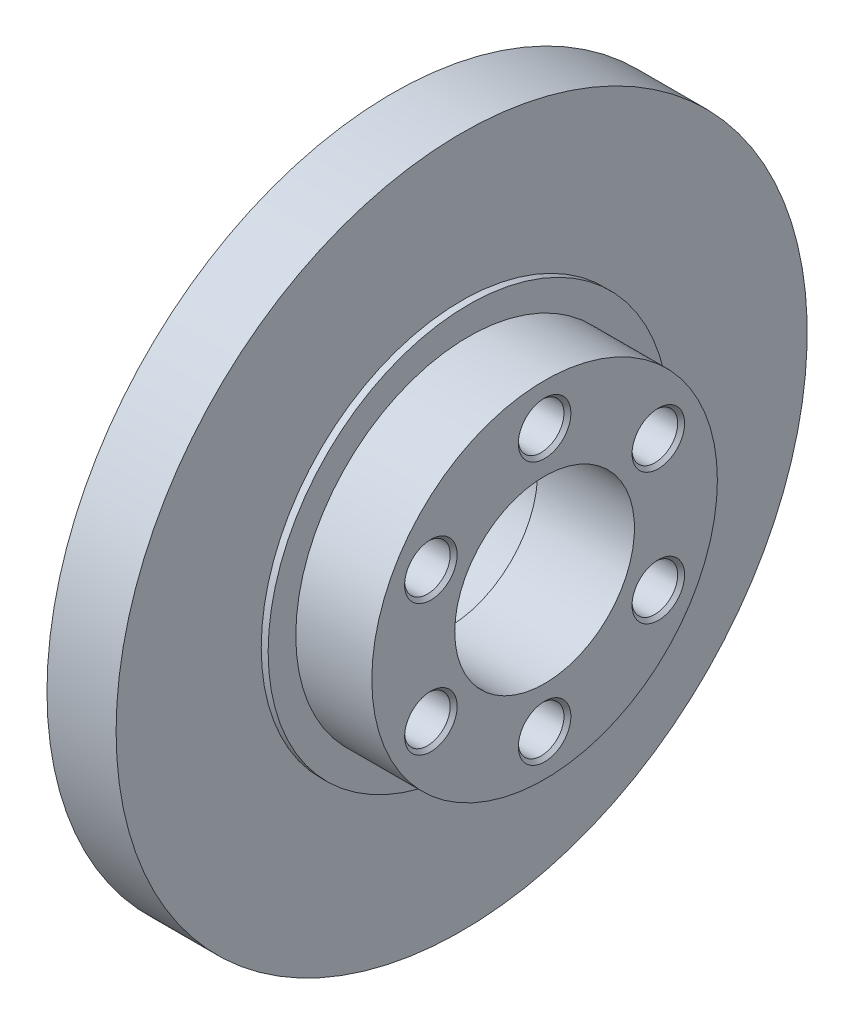
ISO-10303-21;
HEADER;
FILE_DESCRIPTION(('STEP AP214'),'2;1');
FILE_NAME('part.step','',(''),(''),'','','');
FILE_SCHEMA(('AUTOMOTIVE_DESIGN { 1 0 10303 214 1 1 1 1 }'));
ENDSEC;
DATA;
#1=APPLICATION_CONTEXT('core data for automotive mechanical design processes');
#2=APPLICATION_PROTOCOL_DEFINITION('international standard','automotive_design',2000,#1);
#3=PRODUCT_CONTEXT('',#1,'mechanical');
#4=PRODUCT('Part','Part','',(#3));
#5=PRODUCT_RELATED_PRODUCT_CATEGORY('part','',(#4));
#6=PRODUCT_DEFINITION_FORMATION('','',#4);
#7=PRODUCT_DEFINITION_CONTEXT('part definition',#1,'design');
#8=PRODUCT_DEFINITION('design','',#6,#7);
#9=PRODUCT_DEFINITION_SHAPE('','',#8);
#10=(LENGTH_UNIT() NAMED_UNIT(*) SI_UNIT(.MILLI.,.METRE.));
#11=(NAMED_UNIT(*) PLANE_ANGLE_UNIT() SI_UNIT($,.RADIAN.));
#12=(NAMED_UNIT(*) SI_UNIT($,.STERADIAN.) SOLID_ANGLE_UNIT());
#13=UNCERTAINTY_MEASURE_WITH_UNIT(LENGTH_MEASURE(1.E-05),#10,'distance_accuracy_value','');
#14=(GEOMETRIC_REPRESENTATION_CONTEXT(3) GLOBAL_UNCERTAINTY_ASSIGNED_CONTEXT((#13)) GLOBAL_UNIT_ASSIGNED_CONTEXT((#10,
#11,#12)) REPRESENTATION_CONTEXT('',''));
#15=CARTESIAN_POINT('',(0.,0.,0.));
#16=DIRECTION('',(0.,0.,1.));
#17=DIRECTION('',(1.,0.,0.));
#18=AXIS2_PLACEMENT_3D('',#15,#16,#17);
#19=CARTESIAN_POINT('',(0.,14.,0.));
#20=DIRECTION('',(1.,0.,0.));
#21=DIRECTION('',(0.,0.,-1.));
#22=AXIS2_PLACEMENT_3D('',#19,#20,#21);
#23=PLANE('',#22);
#24=CARTESIAN_POINT('',(0.,40.,0.));
#25=DIRECTION('',(1.,0.,0.));
#26=DIRECTION('',(0.,0.,-1.));
#27=AXIS2_PLACEMENT_3D('',#24,#25,#26);
#28=CIRCLE('',#27,2.5);
#29=CARTESIAN_POINT('',(0.,40.,-2.5));
#30=VERTEX_POINT('',#29);
#31=EDGE_CURVE('E200',#30,#30,#28,.T.);
#32=ORIENTED_EDGE('',*,*,#31,.T.);
#33=EDGE_LOOP('',(#32));
#34=FACE_BOUND('',#33,.T.);
#35=CARTESIAN_POINT('',(0.,28.2842712474619,-28.284271247462));
#36=DIRECTION('',(1.,0.,0.));
#37=DIRECTION('',(0.,0.,-1.));
#38=AXIS2_PLACEMENT_3D('',#35,#36,#37);
#39=CIRCLE('',#38,2.5);
#40=CARTESIAN_POINT('',(0.,28.2842712474619,-30.784271247462));
#41=VERTEX_POINT('',#40);
#42=EDGE_CURVE('E196',#41,#41,#39,.T.);
#43=ORIENTED_EDGE('',*,*,#42,.T.);
#44=EDGE_LOOP('',(#43));
#45=FACE_BOUND('',#44,.T.);
#46=CARTESIAN_POINT('',(0.,-1.39659253553725E-13,-40.));
#47=DIRECTION('',(1.,0.,0.));
#48=DIRECTION('',(0.,0.,-1.));
#49=AXIS2_PLACEMENT_3D('',#46,#47,#48);
#50=CIRCLE('',#49,2.5);
#51=CARTESIAN_POINT('',(0.,-1.39659253553725E-13,-42.5));
#52=VERTEX_POINT('',#51);
#53=EDGE_CURVE('E188',#52,#52,#50,.T.);
#54=ORIENTED_EDGE('',*,*,#53,.T.);
#55=EDGE_LOOP('',(#54));
#56=FACE_BOUND('',#55,.T.);
#57=CARTESIAN_POINT('',(0.,-28.2842712474621,-28.2842712474618));
#58=DIRECTION('',(1.,0.,0.));
#59=DIRECTION('',(0.,0.,-1.));
#60=AXIS2_PLACEMENT_3D('',#57,#58,#59);
#61=CIRCLE('',#60,2.5);
#62=CARTESIAN_POINT('',(0.,-28.2842712474621,-30.7842712474617));
#63=VERTEX_POINT('',#62);
#64=EDGE_CURVE('E180',#63,#63,#61,.T.);
#65=ORIENTED_EDGE('',*,*,#64,.T.);
#66=EDGE_LOOP('',(#65));
#67=FACE_BOUND('',#66,.T.);
#68=CARTESIAN_POINT('',(0.,-40.,2.79318507107451E-13));
#69=DIRECTION('',(1.,0.,0.));
#70=DIRECTION('',(0.,0.,-1.));
#71=AXIS2_PLACEMENT_3D('',#68,#69,#70);
#72=CIRCLE('',#71,2.5);
#73=CARTESIAN_POINT('',(0.,-40.,-2.49999999999972));
#74=VERTEX_POINT('',#73);
#75=EDGE_CURVE('E172',#74,#74,#72,.T.);
#76=ORIENTED_EDGE('',*,*,#75,.T.);
#77=EDGE_LOOP('',(#76));
#78=FACE_BOUND('',#77,.T.);
#79=CARTESIAN_POINT('',(0.,-28.2842712474617,28.2842712474621));
#80=DIRECTION('',(1.,0.,0.));
#81=DIRECTION('',(0.,0.,-1.));
#82=AXIS2_PLACEMENT_3D('',#79,#80,#81);
#83=CIRCLE('',#82,2.5);
#84=CARTESIAN_POINT('',(0.,-28.2842712474617,25.7842712474622));
#85=VERTEX_POINT('',#84);
#86=EDGE_CURVE('E164',#85,#85,#83,.T.);
#87=ORIENTED_EDGE('',*,*,#86,.T.);
#88=EDGE_LOOP('',(#87));
#89=FACE_BOUND('',#88,.T.);
#90=CARTESIAN_POINT('',(0.,4.18977760661176E-13,40.));
#91=DIRECTION('',(1.,0.,0.));
#92=DIRECTION('',(0.,0.,-1.));
#93=AXIS2_PLACEMENT_3D('',#90,#91,#92);
#94=CIRCLE('',#93,2.5);
#95=CARTESIAN_POINT('',(0.,4.18977760661176E-13,37.5));
#96=VERTEX_POINT('',#95);
#97=EDGE_CURVE('E156',#96,#96,#94,.T.);
#98=ORIENTED_EDGE('',*,*,#97,.T.);
#99=EDGE_LOOP('',(#98));
#100=FACE_BOUND('',#99,.T.);
#101=CARTESIAN_POINT('',(0.,28.2842712474622,28.2842712474616));
#102=DIRECTION('',(1.,0.,0.));
#103=DIRECTION('',(0.,0.,-1.));
#104=AXIS2_PLACEMENT_3D('',#101,#102,#103);
#105=CIRCLE('',#104,2.5);
#106=CARTESIAN_POINT('',(0.,28.2842712474622,25.7842712474616));
#107=VERTEX_POINT('',#106);
#108=EDGE_CURVE('E147',#107,#107,#105,.T.);
#109=ORIENTED_EDGE('',*,*,#108,.T.);
#110=EDGE_LOOP('',(#109));
#111=FACE_BOUND('',#110,.T.);
#112=CARTESIAN_POINT('',(0.,0.,0.));
#113=DIRECTION('',(-1.,0.,0.));
#114=DIRECTION('',(0.,0.,1.));
#115=AXIS2_PLACEMENT_3D('',#112,#113,#114);
#116=CIRCLE('',#115,14.);
#117=CARTESIAN_POINT('',(0.,0.,14.));
#118=VERTEX_POINT('',#117);
#119=EDGE_CURVE('E138',#118,#118,#116,.T.);
#120=ORIENTED_EDGE('',*,*,#119,.F.);
#121=EDGE_LOOP('',(#120));
#122=FACE_BOUND('',#121,.T.);
#123=CARTESIAN_POINT('',(0.,0.,0.));
#124=DIRECTION('',(-1.,0.,0.));
#125=DIRECTION('',(0.,0.,1.));
#126=AXIS2_PLACEMENT_3D('',#123,#124,#125);
#127=CIRCLE('',#126,50.);
#128=CARTESIAN_POINT('',(0.,0.,50.));
#129=VERTEX_POINT('',#128);
#130=EDGE_CURVE('E102',#129,#129,#127,.T.);
#131=ORIENTED_EDGE('',*,*,#130,.T.);
#132=EDGE_LOOP('',(#131));
#133=FACE_BOUND('',#132,.T.);
#134=ADVANCED_FACE('F45',(#34,#45,#56,#67,#78,#89,#100,#111,#122,#133),#23,.F.);
#135=CARTESIAN_POINT('',(0.,0.,0.));
#136=DIRECTION('',(-1.,0.,0.));
#137=DIRECTION('',(0.,0.,1.));
#138=AXIS2_PLACEMENT_3D('',#135,#136,#137);
#139=CYLINDRICAL_SURFACE('',#138,50.);
#140=ORIENTED_EDGE('',*,*,#130,.F.);
#141=EDGE_LOOP('',(#140));
#142=FACE_BOUND('',#141,.T.);
#143=CARTESIAN_POINT('',(10.,0.,0.));
#144=DIRECTION('',(-1.,0.,0.));
#145=DIRECTION('',(0.,0.,1.));
#146=AXIS2_PLACEMENT_3D('',#143,#144,#145);
#147=CIRCLE('',#146,50.);
#148=CARTESIAN_POINT('',(10.,0.,50.));
#149=VERTEX_POINT('',#148);
#150=EDGE_CURVE('E106',#149,#149,#147,.T.);
#151=ORIENTED_EDGE('',*,*,#150,.T.);
#152=EDGE_LOOP('',(#151));
#153=FACE_BOUND('',#152,.T.);
#154=ADVANCED_FACE('F250',(#142,#153),#139,.T.);
#155=CARTESIAN_POINT('',(10.,50.,0.));
#156=DIRECTION('',(-1.,0.,0.));
#157=DIRECTION('',(0.,0.,1.));
#158=AXIS2_PLACEMENT_3D('',#155,#156,#157);
#159=PLANE('',#158);
#160=ORIENTED_EDGE('',*,*,#150,.F.);
#161=EDGE_LOOP('',(#160));
#162=FACE_BOUND('',#161,.T.);
#163=CARTESIAN_POINT('',(10.,0.,0.));
#164=DIRECTION('',(-1.,0.,0.));
#165=DIRECTION('',(0.,0.,1.));
#166=AXIS2_PLACEMENT_3D('',#163,#164,#165);
#167=CIRCLE('',#166,29.);
#168=CARTESIAN_POINT('',(10.,0.,29.));
#169=VERTEX_POINT('',#168);
#170=EDGE_CURVE('E110',#169,#169,#167,.T.);
#171=ORIENTED_EDGE('',*,*,#170,.T.);
#172=EDGE_LOOP('',(#171));
#173=FACE_BOUND('',#172,.T.);
#174=ADVANCED_FACE('F258',(#162,#173),#159,.F.);
#175=CARTESIAN_POINT('',(0.,0.,0.));
#176=DIRECTION('',(-1.,0.,0.));
#177=DIRECTION('',(0.,0.,1.));
#178=AXIS2_PLACEMENT_3D('',#175,#176,#177);
#179=CYLINDRICAL_SURFACE('',#178,29.);
#180=ORIENTED_EDGE('',*,*,#170,.F.);
#181=EDGE_LOOP('',(#180));
#182=FACE_BOUND('',#181,.T.);
#183=CARTESIAN_POINT('',(11.,0.,0.));
#184=DIRECTION('',(-1.,0.,0.));
#185=DIRECTION('',(0.,0.,1.));
#186=AXIS2_PLACEMENT_3D('',#183,#184,#185);
#187=CIRCLE('',#186,29.);
#188=CARTESIAN_POINT('',(11.,0.,29.));
#189=VERTEX_POINT('',#188);
#190=EDGE_CURVE('E114',#189,#189,#187,.T.);
#191=ORIENTED_EDGE('',*,*,#190,.T.);
#192=EDGE_LOOP('',(#191));
#193=FACE_BOUND('',#192,.T.);
#194=ADVANCED_FACE('F339',(#182,#193),#179,.T.);
#195=CARTESIAN_POINT('',(11.,29.,0.));
#196=DIRECTION('',(-1.,0.,0.));
#197=DIRECTION('',(0.,0.,1.));
#198=AXIS2_PLACEMENT_3D('',#195,#196,#197);
#199=PLANE('',#198);
#200=ORIENTED_EDGE('',*,*,#190,.F.);
#201=EDGE_LOOP('',(#200));
#202=FACE_BOUND('',#201,.T.);
#203=CARTESIAN_POINT('',(11.,0.,0.));
#204=DIRECTION('',(-1.,0.,0.));
#205=DIRECTION('',(0.,0.,1.));
#206=AXIS2_PLACEMENT_3D('',#203,#204,#205);
#207=CIRCLE('',#206,25.);
#208=CARTESIAN_POINT('',(11.,0.,25.));
#209=VERTEX_POINT('',#208);
#210=EDGE_CURVE('E118',#209,#209,#207,.T.);
#211=ORIENTED_EDGE('',*,*,#210,.T.);
#212=EDGE_LOOP('',(#211));
#213=FACE_BOUND('',#212,.T.);
#214=ADVANCED_FACE('F344',(#202,#213),#199,.F.);
#215=CARTESIAN_POINT('',(0.,0.,0.));
#216=DIRECTION('',(-1.,0.,0.));
#217=DIRECTION('',(0.,0.,1.));
#218=AXIS2_PLACEMENT_3D('',#215,#216,#217);
#219=CYLINDRICAL_SURFACE('',#218,25.);
#220=ORIENTED_EDGE('',*,*,#210,.F.);
#221=EDGE_LOOP('',(#220));
#222=FACE_BOUND('',#221,.T.);
#223=CARTESIAN_POINT('',(22.,0.,0.));
#224=DIRECTION('',(-1.,0.,0.));
#225=DIRECTION('',(0.,0.,1.));
#226=AXIS2_PLACEMENT_3D('',#223,#224,#225);
#227=CIRCLE('',#226,25.);
#228=CARTESIAN_POINT('',(22.,0.,25.));
#229=VERTEX_POINT('',#228);
#230=EDGE_CURVE('E122',#229,#229,#227,.T.);
#231=ORIENTED_EDGE('',*,*,#230,.T.);
#232=EDGE_LOOP('',(#231));
#233=FACE_BOUND('',#232,.T.);
#234=ADVANCED_FACE('F306',(#222,#233),#219,.T.);
#235=CARTESIAN_POINT('',(22.,25.,0.));
#236=DIRECTION('',(-1.,0.,0.));
#237=DIRECTION('',(0.,0.,1.));
#238=AXIS2_PLACEMENT_3D('',#235,#236,#237);
#239=PLANE('',#238);
#240=CARTESIAN_POINT('',(22.,9.50000000000019,16.4544826719042));
#241=DIRECTION('',(-1.,0.,0.));
#242=DIRECTION('',(0.,0.,1.));
#243=AXIS2_PLACEMENT_3D('',#240,#241,#242);
#244=CIRCLE('',#243,3.79999999999998);
#245=CARTESIAN_POINT('',(22.,9.50000000000019,20.2544826719042));
#246=VERTEX_POINT('',#245);
#247=EDGE_CURVE('E74',#246,#246,#244,.T.);
#248=ORIENTED_EDGE('',*,*,#247,.T.);
#249=EDGE_LOOP('',(#248));
#250=FACE_BOUND('',#249,.T.);
#251=CARTESIAN_POINT('',(22.,-9.49999999999985,16.4544826719044));
#252=DIRECTION('',(-1.,0.,0.));
#253=DIRECTION('',(0.,0.,1.));
#254=AXIS2_PLACEMENT_3D('',#251,#252,#253);
#255=CIRCLE('',#254,3.79999999999998);
#256=CARTESIAN_POINT('',(22.,-9.49999999999985,20.2544826719044));
#257=VERTEX_POINT('',#256);
#258=EDGE_CURVE('E78',#257,#257,#255,.T.);
#259=ORIENTED_EDGE('',*,*,#258,.T.);
#260=EDGE_LOOP('',(#259));
#261=FACE_BOUND('',#260,.T.);
#262=CARTESIAN_POINT('',(22.,-19.,1.32676290876039E-13));
#263=DIRECTION('',(-1.,0.,0.));
#264=DIRECTION('',(0.,0.,1.));
#265=AXIS2_PLACEMENT_3D('',#262,#263,#264);
#266=CIRCLE('',#265,3.8);
#267=CARTESIAN_POINT('',(22.,-19.,3.80000000000013));
#268=VERTEX_POINT('',#267);
#269=EDGE_CURVE('E82',#268,#268,#266,.T.);
#270=ORIENTED_EDGE('',*,*,#269,.T.);
#271=EDGE_LOOP('',(#270));
#272=FACE_BOUND('',#271,.T.);
#273=CARTESIAN_POINT('',(22.,-9.50000000000008,-16.4544826719043));
#274=DIRECTION('',(-1.,0.,0.));
#275=DIRECTION('',(0.,0.,1.));
#276=AXIS2_PLACEMENT_3D('',#273,#274,#275);
#277=CIRCLE('',#276,3.79999999999998);
#278=CARTESIAN_POINT('',(22.,-9.50000000000008,-12.6544826719043));
#279=VERTEX_POINT('',#278);
#280=EDGE_CURVE('E86',#279,#279,#277,.T.);
#281=ORIENTED_EDGE('',*,*,#280,.T.);
#282=EDGE_LOOP('',(#281));
#283=FACE_BOUND('',#282,.T.);
#284=CARTESIAN_POINT('',(22.,9.49999999999996,-16.4544826719044));
#285=DIRECTION('',(-1.,0.,0.));
#286=DIRECTION('',(0.,0.,1.));
#287=AXIS2_PLACEMENT_3D('',#284,#285,#286);
#288=CIRCLE('',#287,3.79999999999998);
#289=CARTESIAN_POINT('',(22.,9.49999999999996,-12.6544826719044));
#290=VERTEX_POINT('',#289);
#291=EDGE_CURVE('E90',#290,#290,#288,.T.);
#292=ORIENTED_EDGE('',*,*,#291,.T.);
#293=EDGE_LOOP('',(#292));
#294=FACE_BOUND('',#293,.T.);
#295=CARTESIAN_POINT('',(22.,19.,0.));
#296=DIRECTION('',(-1.,0.,0.));
#297=DIRECTION('',(0.,0.,1.));
#298=AXIS2_PLACEMENT_3D('',#295,#296,#297);
#299=CIRCLE('',#298,3.8);
#300=CARTESIAN_POINT('',(22.,19.,3.8));
#301=VERTEX_POINT('',#300);
#302=EDGE_CURVE('E94',#301,#301,#299,.T.);
#303=ORIENTED_EDGE('',*,*,#302,.T.);
#304=EDGE_LOOP('',(#303));
#305=FACE_BOUND('',#304,.T.);
#306=ORIENTED_EDGE('',*,*,#230,.F.);
#307=EDGE_LOOP('',(#306));
#308=FACE_BOUND('',#307,.T.);
#309=CARTESIAN_POINT('',(22.,0.,0.));
#310=DIRECTION('',(-1.,0.,0.));
#311=DIRECTION('',(0.,0.,1.));
#312=AXIS2_PLACEMENT_3D('',#309,#310,#311);
#313=CIRCLE('',#312,13.);
#314=CARTESIAN_POINT('',(22.,0.,13.));
#315=VERTEX_POINT('',#314);
#316=EDGE_CURVE('E126',#315,#315,#313,.T.);
#317=ORIENTED_EDGE('',*,*,#316,.T.);
#318=EDGE_LOOP('',(#317));
#319=FACE_BOUND('',#318,.T.);
#320=ADVANCED_FACE('F302',(#250,#261,#272,#283,#294,#305,#308,#319),#239,.F.);
#321=CARTESIAN_POINT('',(0.,0.,0.));
#322=DIRECTION('',(-1.,0.,0.));
#323=DIRECTION('',(0.,0.,1.));
#324=AXIS2_PLACEMENT_3D('',#321,#322,#323);
#325=CYLINDRICAL_SURFACE('',#324,13.);
#326=ORIENTED_EDGE('',*,*,#316,.F.);
#327=EDGE_LOOP('',(#326));
#328=FACE_BOUND('',#327,.T.);
#329=CARTESIAN_POINT('',(8.00000000000001,0.,0.));
#330=DIRECTION('',(-1.,0.,0.));
#331=DIRECTION('',(0.,0.,1.));
#332=AXIS2_PLACEMENT_3D('',#329,#330,#331);
#333=CIRCLE('',#332,13.);
#334=CARTESIAN_POINT('',(8.00000000000001,0.,13.));
#335=VERTEX_POINT('',#334);
#336=EDGE_CURVE('E130',#335,#335,#333,.T.);
#337=ORIENTED_EDGE('',*,*,#336,.T.);
#338=EDGE_LOOP('',(#337));
#339=FACE_BOUND('',#338,.T.);
#340=ADVANCED_FACE('F305',(#328,#339),#325,.F.);
#341=CARTESIAN_POINT('',(8.00000000000001,13.,0.));
#342=DIRECTION('',(1.,0.,0.));
#343=DIRECTION('',(0.,0.,-1.));
#344=AXIS2_PLACEMENT_3D('',#341,#342,#343);
#345=PLANE('',#344);
#346=ORIENTED_EDGE('',*,*,#336,.F.);
#347=EDGE_LOOP('',(#346));
#348=FACE_BOUND('',#347,.T.);
#349=CARTESIAN_POINT('',(8.00000000000001,0.,0.));
#350=DIRECTION('',(-1.,0.,0.));
#351=DIRECTION('',(0.,0.,1.));
#352=AXIS2_PLACEMENT_3D('',#349,#350,#351);
#353=CIRCLE('',#352,14.);
#354=CARTESIAN_POINT('',(8.00000000000001,0.,14.));
#355=VERTEX_POINT('',#354);
#356=EDGE_CURVE('E134',#355,#355,#353,.T.);
#357=ORIENTED_EDGE('',*,*,#356,.T.);
#358=EDGE_LOOP('',(#357));
#359=FACE_BOUND('',#358,.T.);
#360=ADVANCED_FACE('F317',(#348,#359),#345,.F.);
#361=CARTESIAN_POINT('',(0.,0.,0.));
#362=DIRECTION('',(-1.,0.,0.));
#363=DIRECTION('',(0.,0.,1.));
#364=AXIS2_PLACEMENT_3D('',#361,#362,#363);
#365=CYLINDRICAL_SURFACE('',#364,14.);
#366=ORIENTED_EDGE('',*,*,#356,.F.);
#367=EDGE_LOOP('',(#366));
#368=FACE_BOUND('',#367,.T.);
#369=ORIENTED_EDGE('',*,*,#119,.T.);
#370=EDGE_LOOP('',(#369));
#371=FACE_BOUND('',#370,.T.);
#372=ADVANCED_FACE('F323',(#368,#371),#365,.F.);
#373=CARTESIAN_POINT('',(4.,28.2842712474622,28.2842712474616));
#374=DIRECTION('',(-1.,0.,0.));
#375=DIRECTION('',(0.,0.,1.));
#376=AXIS2_PLACEMENT_3D('',#373,#374,#375);
#377=CYLINDRICAL_SURFACE('',#376,2.5);
#378=CARTESIAN_POINT('',(4.,28.2842712474622,28.2842712474616));
#379=DIRECTION('',(1.,0.,0.));
#380=DIRECTION('',(0.,0.,-1.));
#381=AXIS2_PLACEMENT_3D('',#378,#379,#380);
#382=CIRCLE('',#381,2.5);
#383=CARTESIAN_POINT('',(4.,28.2842712474622,25.7842712474616));
#384=VERTEX_POINT('',#383);
#385=EDGE_CURVE('E143',#384,#384,#382,.T.);
#386=ORIENTED_EDGE('',*,*,#385,.T.);
#387=EDGE_LOOP('',(#386));
#388=FACE_BOUND('',#387,.T.);
#389=ORIENTED_EDGE('',*,*,#108,.F.);
#390=EDGE_LOOP('',(#389));
#391=FACE_BOUND('',#390,.T.);
#392=ADVANCED_FACE('F328',(#388,#391),#377,.F.);
#393=CARTESIAN_POINT('',(4.,28.2842712474622,28.2842712474616));
#394=DIRECTION('',(1.,0.,0.));
#395=DIRECTION('',(0.,0.,-1.));
#396=AXIS2_PLACEMENT_3D('',#393,#394,#395);
#397=PLANE('',#396);
#398=ORIENTED_EDGE('',*,*,#385,.F.);
#399=EDGE_LOOP('',(#398));
#400=FACE_BOUND('',#399,.T.);
#401=ADVANCED_FACE('F359',(#400),#397,.F.);
#402=CARTESIAN_POINT('',(4.,4.18977760661176E-13,40.));
#403=DIRECTION('',(-1.,0.,0.));
#404=DIRECTION('',(0.,0.,1.));
#405=AXIS2_PLACEMENT_3D('',#402,#403,#404);
#406=CYLINDRICAL_SURFACE('',#405,2.5);
#407=CARTESIAN_POINT('',(4.,4.18977760661176E-13,40.));
#408=DIRECTION('',(1.,0.,0.));
#409=DIRECTION('',(0.,0.,-1.));
#410=AXIS2_PLACEMENT_3D('',#407,#408,#409);
#411=CIRCLE('',#410,2.5);
#412=CARTESIAN_POINT('',(4.,4.18977760661176E-13,37.5));
#413=VERTEX_POINT('',#412);
#414=EDGE_CURVE('E152',#413,#413,#411,.T.);
#415=ORIENTED_EDGE('',*,*,#414,.T.);
#416=EDGE_LOOP('',(#415));
#417=FACE_BOUND('',#416,.T.);
#418=ORIENTED_EDGE('',*,*,#97,.F.);
#419=EDGE_LOOP('',(#418));
#420=FACE_BOUND('',#419,.T.);
#421=ADVANCED_FACE('F362',(#417,#420),#406,.F.);
#422=CARTESIAN_POINT('',(4.,4.18977760661176E-13,40.));
#423=DIRECTION('',(1.,0.,0.));
#424=DIRECTION('',(0.,0.,-1.));
#425=AXIS2_PLACEMENT_3D('',#422,#423,#424);
#426=PLANE('',#425);
#427=ORIENTED_EDGE('',*,*,#414,.F.);
#428=EDGE_LOOP('',(#427));
#429=FACE_BOUND('',#428,.T.);
#430=ADVANCED_FACE('F366',(#429),#426,.F.);
#431=CARTESIAN_POINT('',(4.,-28.2842712474617,28.2842712474621));
#432=DIRECTION('',(-1.,0.,0.));
#433=DIRECTION('',(0.,0.,1.));
#434=AXIS2_PLACEMENT_3D('',#431,#432,#433);
#435=CYLINDRICAL_SURFACE('',#434,2.5);
#436=CARTESIAN_POINT('',(4.,-28.2842712474617,28.2842712474621));
#437=DIRECTION('',(1.,0.,0.));
#438=DIRECTION('',(0.,0.,-1.));
#439=AXIS2_PLACEMENT_3D('',#436,#437,#438);
#440=CIRCLE('',#439,2.5);
#441=CARTESIAN_POINT('',(4.,-28.2842712474617,25.7842712474622));
#442=VERTEX_POINT('',#441);
#443=EDGE_CURVE('E160',#442,#442,#440,.T.);
#444=ORIENTED_EDGE('',*,*,#443,.T.);
#445=EDGE_LOOP('',(#444));
#446=FACE_BOUND('',#445,.T.);
#447=ORIENTED_EDGE('',*,*,#86,.F.);
#448=EDGE_LOOP('',(#447));
#449=FACE_BOUND('',#448,.T.);
#450=ADVANCED_FACE('F369',(#446,#449),#435,.F.);
#451=CARTESIAN_POINT('',(4.,-28.2842712474617,28.2842712474621));
#452=DIRECTION('',(1.,0.,0.));
#453=DIRECTION('',(0.,0.,-1.));
#454=AXIS2_PLACEMENT_3D('',#451,#452,#453);
#455=PLANE('',#454);
#456=ORIENTED_EDGE('',*,*,#443,.F.);
#457=EDGE_LOOP('',(#456));
#458=FACE_BOUND('',#457,.T.);
#459=ADVANCED_FACE('F374',(#458),#455,.F.);
#460=CARTESIAN_POINT('',(4.,-40.,2.79318507107451E-13));
#461=DIRECTION('',(-1.,0.,0.));
#462=DIRECTION('',(0.,0.,1.));
#463=AXIS2_PLACEMENT_3D('',#460,#461,#462);
#464=CYLINDRICAL_SURFACE('',#463,2.5);
#465=CARTESIAN_POINT('',(4.,-40.,2.79318507107451E-13));
#466=DIRECTION('',(1.,0.,0.));
#467=DIRECTION('',(0.,0.,-1.));
#468=AXIS2_PLACEMENT_3D('',#465,#466,#467);
#469=CIRCLE('',#468,2.5);
#470=CARTESIAN_POINT('',(4.,-40.,-2.49999999999972));
#471=VERTEX_POINT('',#470);
#472=EDGE_CURVE('E168',#471,#471,#469,.T.);
#473=ORIENTED_EDGE('',*,*,#472,.T.);
#474=EDGE_LOOP('',(#473));
#475=FACE_BOUND('',#474,.T.);
#476=ORIENTED_EDGE('',*,*,#75,.F.);
#477=EDGE_LOOP('',(#476));
#478=FACE_BOUND('',#477,.T.);
#479=ADVANCED_FACE('F377',(#475,#478),#464,.F.);
#480=CARTESIAN_POINT('',(4.,-40.,2.79318507107451E-13));
#481=DIRECTION('',(1.,0.,0.));
#482=DIRECTION('',(0.,0.,-1.));
#483=AXIS2_PLACEMENT_3D('',#480,#481,#482);
#484=PLANE('',#483);
#485=ORIENTED_EDGE('',*,*,#472,.F.);
#486=EDGE_LOOP('',(#485));
#487=FACE_BOUND('',#486,.T.);
#488=ADVANCED_FACE('F382',(#487),#484,.F.);
#489=CARTESIAN_POINT('',(4.,-28.2842712474621,-28.2842712474618));
#490=DIRECTION('',(-1.,0.,0.));
#491=DIRECTION('',(0.,0.,1.));
#492=AXIS2_PLACEMENT_3D('',#489,#490,#491);
#493=CYLINDRICAL_SURFACE('',#492,2.5);
#494=CARTESIAN_POINT('',(4.,-28.2842712474621,-28.2842712474618));
#495=DIRECTION('',(1.,0.,0.));
#496=DIRECTION('',(0.,0.,-1.));
#497=AXIS2_PLACEMENT_3D('',#494,#495,#496);
#498=CIRCLE('',#497,2.5);
#499=CARTESIAN_POINT('',(4.,-28.2842712474621,-30.7842712474617));
#500=VERTEX_POINT('',#499);
#501=EDGE_CURVE('E176',#500,#500,#498,.T.);
#502=ORIENTED_EDGE('',*,*,#501,.T.);
#503=EDGE_LOOP('',(#502));
#504=FACE_BOUND('',#503,.T.);
#505=ORIENTED_EDGE('',*,*,#64,.F.);
#506=EDGE_LOOP('',(#505));
#507=FACE_BOUND('',#506,.T.);
#508=ADVANCED_FACE('F385',(#504,#507),#493,.F.);
#509=CARTESIAN_POINT('',(4.,-28.2842712474621,-28.2842712474618));
#510=DIRECTION('',(1.,0.,0.));
#511=DIRECTION('',(0.,0.,-1.));
#512=AXIS2_PLACEMENT_3D('',#509,#510,#511);
#513=PLANE('',#512);
#514=ORIENTED_EDGE('',*,*,#501,.F.);
#515=EDGE_LOOP('',(#514));
#516=FACE_BOUND('',#515,.T.);
#517=ADVANCED_FACE('F390',(#516),#513,.F.);
#518=CARTESIAN_POINT('',(4.,-1.39659253553725E-13,-40.));
#519=DIRECTION('',(-1.,0.,0.));
#520=DIRECTION('',(0.,0.,1.));
#521=AXIS2_PLACEMENT_3D('',#518,#519,#520);
#522=CYLINDRICAL_SURFACE('',#521,2.5);
#523=CARTESIAN_POINT('',(4.,-1.39659253553725E-13,-40.));
#524=DIRECTION('',(1.,0.,0.));
#525=DIRECTION('',(0.,0.,-1.));
#526=AXIS2_PLACEMENT_3D('',#523,#524,#525);
#527=CIRCLE('',#526,2.5);
#528=CARTESIAN_POINT('',(4.,-1.39659253553725E-13,-42.5));
#529=VERTEX_POINT('',#528);
#530=EDGE_CURVE('E184',#529,#529,#527,.T.);
#531=ORIENTED_EDGE('',*,*,#530,.T.);
#532=EDGE_LOOP('',(#531));
#533=FACE_BOUND('',#532,.T.);
#534=ORIENTED_EDGE('',*,*,#53,.F.);
#535=EDGE_LOOP('',(#534));
#536=FACE_BOUND('',#535,.T.);
#537=ADVANCED_FACE('F393',(#533,#536),#522,.F.);
#538=CARTESIAN_POINT('',(4.,-1.39659253553725E-13,-40.));
#539=DIRECTION('',(1.,0.,0.));
#540=DIRECTION('',(0.,0.,-1.));
#541=AXIS2_PLACEMENT_3D('',#538,#539,#540);
#542=PLANE('',#541);
#543=ORIENTED_EDGE('',*,*,#530,.F.);
#544=EDGE_LOOP('',(#543));
#545=FACE_BOUND('',#544,.T.);
#546=ADVANCED_FACE('F398',(#545),#542,.F.);
#547=CARTESIAN_POINT('',(4.,28.2842712474619,-28.284271247462));
#548=DIRECTION('',(-1.,0.,0.));
#549=DIRECTION('',(0.,0.,1.));
#550=AXIS2_PLACEMENT_3D('',#547,#548,#549);
#551=CYLINDRICAL_SURFACE('',#550,2.5);
#552=CARTESIAN_POINT('',(4.,28.2842712474619,-28.284271247462));
#553=DIRECTION('',(1.,0.,0.));
#554=DIRECTION('',(0.,0.,-1.));
#555=AXIS2_PLACEMENT_3D('',#552,#553,#554);
#556=CIRCLE('',#555,2.5);
#557=CARTESIAN_POINT('',(4.,28.2842712474619,-30.784271247462));
#558=VERTEX_POINT('',#557);
#559=EDGE_CURVE('E192',#558,#558,#556,.T.);
#560=ORIENTED_EDGE('',*,*,#559,.T.);
#561=EDGE_LOOP('',(#560));
#562=FACE_BOUND('',#561,.T.);
#563=ORIENTED_EDGE('',*,*,#42,.F.);
#564=EDGE_LOOP('',(#563));
#565=FACE_BOUND('',#564,.T.);
#566=ADVANCED_FACE('F401',(#562,#565),#551,.F.);
#567=CARTESIAN_POINT('',(4.,28.2842712474619,-28.284271247462));
#568=DIRECTION('',(1.,0.,0.));
#569=DIRECTION('',(0.,0.,-1.));
#570=AXIS2_PLACEMENT_3D('',#567,#568,#569);
#571=PLANE('',#570);
#572=ORIENTED_EDGE('',*,*,#559,.F.);
#573=EDGE_LOOP('',(#572));
#574=FACE_BOUND('',#573,.T.);
#575=ADVANCED_FACE('F406',(#574),#571,.F.);
#576=CARTESIAN_POINT('',(4.,40.,0.));
#577=DIRECTION('',(-1.,0.,0.));
#578=DIRECTION('',(0.,0.,1.));
#579=AXIS2_PLACEMENT_3D('',#576,#577,#578);
#580=CYLINDRICAL_SURFACE('',#579,2.5);
#581=CARTESIAN_POINT('',(4.,40.,0.));
#582=DIRECTION('',(1.,0.,0.));
#583=DIRECTION('',(0.,0.,-1.));
#584=AXIS2_PLACEMENT_3D('',#581,#582,#583);
#585=CIRCLE('',#584,2.5);
#586=CARTESIAN_POINT('',(4.,40.,-2.5));
#587=VERTEX_POINT('',#586);
#588=EDGE_CURVE('E142',#587,#587,#585,.T.);
#589=ORIENTED_EDGE('',*,*,#588,.T.);
#590=EDGE_LOOP('',(#589));
#591=FACE_BOUND('',#590,.T.);
#592=ORIENTED_EDGE('',*,*,#31,.F.);
#593=EDGE_LOOP('',(#592));
#594=FACE_BOUND('',#593,.T.);
#595=ADVANCED_FACE('F409',(#591,#594),#580,.F.);
#596=CARTESIAN_POINT('',(4.,40.,0.));
#597=DIRECTION('',(1.,0.,0.));
#598=DIRECTION('',(0.,0.,-1.));
#599=AXIS2_PLACEMENT_3D('',#596,#597,#598);
#600=PLANE('',#599);
#601=ORIENTED_EDGE('',*,*,#588,.F.);
#602=EDGE_LOOP('',(#601));
#603=FACE_BOUND('',#602,.T.);
#604=ADVANCED_FACE('F416',(#603),#600,.F.);
#605=CARTESIAN_POINT('',(12.,9.49999999999996,-16.4544826719044));
#606=DIRECTION('',(1.,0.,0.));
#607=DIRECTION('',(0.,0.,-1.));
#608=AXIS2_PLACEMENT_3D('',#605,#606,#607);
#609=CYLINDRICAL_SURFACE('',#608,3.3);
#610=CARTESIAN_POINT('',(21.5,9.49999999999996,-16.4544826719044));
#611=DIRECTION('',(-1.,0.,0.));
#612=DIRECTION('',(0.,0.,1.));
#613=AXIS2_PLACEMENT_3D('',#610,#611,#612);
#614=CIRCLE('',#613,3.3);
#615=CARTESIAN_POINT('',(21.5,9.49999999999996,-13.1544826719044));
#616=VERTEX_POINT('',#615);
#617=EDGE_CURVE('E54',#616,#616,#614,.F.);
#618=ORIENTED_EDGE('',*,*,#617,.T.);
#619=EDGE_LOOP('',(#618));
#620=FACE_BOUND('',#619,.T.);
#621=CARTESIAN_POINT('',(12.,9.49999999999996,-16.4544826719044));
#622=DIRECTION('',(1.,0.,0.));
#623=DIRECTION('',(0.,0.,-1.));
#624=AXIS2_PLACEMENT_3D('',#621,#622,#623);
#625=CIRCLE('',#624,3.3);
#626=CARTESIAN_POINT('',(12.,9.49999999999996,-19.7544826719044));
#627=VERTEX_POINT('',#626);
#628=EDGE_CURVE('E220',#627,#627,#625,.T.);
#629=ORIENTED_EDGE('',*,*,#628,.F.);
#630=EDGE_LOOP('',(#629));
#631=FACE_BOUND('',#630,.T.);
#632=ADVANCED_FACE('F420',(#620,#631),#609,.F.);
#633=CARTESIAN_POINT('',(12.,9.49999999999996,-16.4544826719044));
#634=DIRECTION('',(1.,0.,0.));
#635=DIRECTION('',(0.,0.,-1.));
#636=AXIS2_PLACEMENT_3D('',#633,#634,#635);
#637=PLANE('',#636);
#638=ORIENTED_EDGE('',*,*,#628,.T.);
#639=EDGE_LOOP('',(#638));
#640=FACE_BOUND('',#639,.T.);
#641=ADVANCED_FACE('F445',(#640),#637,.T.);
#642=CARTESIAN_POINT('',(12.,-9.50000000000008,-16.4544826719043));
#643=DIRECTION('',(1.,0.,0.));
#644=DIRECTION('',(0.,0.,-1.));
#645=AXIS2_PLACEMENT_3D('',#642,#643,#644);
#646=CYLINDRICAL_SURFACE('',#645,3.3);
#647=CARTESIAN_POINT('',(21.5,-9.50000000000008,-16.4544826719043));
#648=DIRECTION('',(-1.,0.,0.));
#649=DIRECTION('',(0.,0.,1.));
#650=AXIS2_PLACEMENT_3D('',#647,#648,#649);
#651=CIRCLE('',#650,3.3);
#652=CARTESIAN_POINT('',(21.5,-9.50000000000008,-13.1544826719043));
#653=VERTEX_POINT('',#652);
#654=EDGE_CURVE('E59',#653,#653,#651,.F.);
#655=ORIENTED_EDGE('',*,*,#654,.T.);
#656=EDGE_LOOP('',(#655));
#657=FACE_BOUND('',#656,.T.);
#658=CARTESIAN_POINT('',(12.,-9.50000000000008,-16.4544826719043));
#659=DIRECTION('',(1.,0.,0.));
#660=DIRECTION('',(0.,0.,-1.));
#661=AXIS2_PLACEMENT_3D('',#658,#659,#660);
#662=CIRCLE('',#661,3.3);
#663=CARTESIAN_POINT('',(12.,-9.50000000000008,-19.7544826719043));
#664=VERTEX_POINT('',#663);
#665=EDGE_CURVE('E216',#664,#664,#662,.T.);
#666=ORIENTED_EDGE('',*,*,#665,.F.);
#667=EDGE_LOOP('',(#666));
#668=FACE_BOUND('',#667,.T.);
#669=ADVANCED_FACE('F441',(#657,#668),#646,.F.);
#670=CARTESIAN_POINT('',(12.,-9.50000000000008,-16.4544826719043));
#671=DIRECTION('',(1.,0.,0.));
#672=DIRECTION('',(0.,0.,-1.));
#673=AXIS2_PLACEMENT_3D('',#670,#671,#672);
#674=PLANE('',#673);
#675=ORIENTED_EDGE('',*,*,#665,.T.);
#676=EDGE_LOOP('',(#675));
#677=FACE_BOUND('',#676,.T.);
#678=ADVANCED_FACE('F437',(#677),#674,.T.);
#679=CARTESIAN_POINT('',(12.,-19.,1.32676290876039E-13));
#680=DIRECTION('',(1.,0.,0.));
#681=DIRECTION('',(0.,0.,-1.));
#682=AXIS2_PLACEMENT_3D('',#679,#680,#681);
#683=CYLINDRICAL_SURFACE('',#682,3.3);
#684=CARTESIAN_POINT('',(21.5,-19.,1.32676290876039E-13));
#685=DIRECTION('',(-1.,0.,0.));
#686=DIRECTION('',(0.,0.,1.));
#687=AXIS2_PLACEMENT_3D('',#684,#685,#686);
#688=CIRCLE('',#687,3.3);
#689=CARTESIAN_POINT('',(21.5,-19.,3.30000000000013));
#690=VERTEX_POINT('',#689);
#691=EDGE_CURVE('E64',#690,#690,#688,.F.);
#692=ORIENTED_EDGE('',*,*,#691,.T.);
#693=EDGE_LOOP('',(#692));
#694=FACE_BOUND('',#693,.T.);
#695=CARTESIAN_POINT('',(12.,-19.,1.32676290876039E-13));
#696=DIRECTION('',(1.,0.,0.));
#697=DIRECTION('',(0.,0.,-1.));
#698=AXIS2_PLACEMENT_3D('',#695,#696,#697);
#699=CIRCLE('',#698,3.3);
#700=CARTESIAN_POINT('',(12.,-19.,-3.29999999999987));
#701=VERTEX_POINT('',#700);
#702=EDGE_CURVE('E211',#701,#701,#699,.T.);
#703=ORIENTED_EDGE('',*,*,#702,.F.);
#704=EDGE_LOOP('',(#703));
#705=FACE_BOUND('',#704,.T.);
#706=ADVANCED_FACE('F433',(#694,#705),#683,.F.);
#707=CARTESIAN_POINT('',(12.,-19.,1.32676290876039E-13));
#708=DIRECTION('',(1.,0.,0.));
#709=DIRECTION('',(0.,0.,-1.));
#710=AXIS2_PLACEMENT_3D('',#707,#708,#709);
#711=PLANE('',#710);
#712=ORIENTED_EDGE('',*,*,#702,.T.);
#713=EDGE_LOOP('',(#712));
#714=FACE_BOUND('',#713,.T.);
#715=ADVANCED_FACE('F429',(#714),#711,.T.);
#716=CARTESIAN_POINT('',(12.,-9.49999999999985,16.4544826719044));
#717=DIRECTION('',(1.,0.,0.));
#718=DIRECTION('',(0.,0.,-1.));
#719=AXIS2_PLACEMENT_3D('',#716,#717,#718);
#720=CYLINDRICAL_SURFACE('',#719,3.3);
#721=CARTESIAN_POINT('',(21.5,-9.49999999999985,16.4544826719044));
#722=DIRECTION('',(-1.,0.,0.));
#723=DIRECTION('',(0.,0.,1.));
#724=AXIS2_PLACEMENT_3D('',#721,#722,#723);
#725=CIRCLE('',#724,3.3);
#726=CARTESIAN_POINT('',(21.5,-9.49999999999985,19.7544826719044));
#727=VERTEX_POINT('',#726);
#728=EDGE_CURVE('E70',#727,#727,#725,.F.);
#729=ORIENTED_EDGE('',*,*,#728,.T.);
#730=EDGE_LOOP('',(#729));
#731=FACE_BOUND('',#730,.T.);
#732=CARTESIAN_POINT('',(12.,-9.49999999999985,16.4544826719044));
#733=DIRECTION('',(1.,0.,0.));
#734=DIRECTION('',(0.,0.,-1.));
#735=AXIS2_PLACEMENT_3D('',#732,#733,#734);
#736=CIRCLE('',#735,3.3);
#737=CARTESIAN_POINT('',(12.,-9.49999999999985,13.1544826719044));
#738=VERTEX_POINT('',#737);
#739=EDGE_CURVE('E207',#738,#738,#736,.T.);
#740=ORIENTED_EDGE('',*,*,#739,.F.);
#741=EDGE_LOOP('',(#740));
#742=FACE_BOUND('',#741,.T.);
#743=ADVANCED_FACE('F425',(#731,#742),#720,.F.);
#744=CARTESIAN_POINT('',(12.,-9.49999999999985,16.4544826719044));
#745=DIRECTION('',(1.,0.,0.));
#746=DIRECTION('',(0.,0.,-1.));
#747=AXIS2_PLACEMENT_3D('',#744,#745,#746);
#748=PLANE('',#747);
#749=ORIENTED_EDGE('',*,*,#739,.T.);
#750=EDGE_LOOP('',(#749));
#751=FACE_BOUND('',#750,.T.);
#752=ADVANCED_FACE('F422',(#751),#748,.T.);
#753=CARTESIAN_POINT('',(12.,9.50000000000019,16.4544826719042));
#754=DIRECTION('',(1.,0.,0.));
#755=DIRECTION('',(0.,0.,-1.));
#756=AXIS2_PLACEMENT_3D('',#753,#754,#755);
#757=CYLINDRICAL_SURFACE('',#756,3.3);
#758=CARTESIAN_POINT('',(21.5,9.50000000000019,16.4544826719042));
#759=DIRECTION('',(-1.,0.,0.));
#760=DIRECTION('',(0.,0.,1.));
#761=AXIS2_PLACEMENT_3D('',#758,#759,#760);
#762=CIRCLE('',#761,3.3);
#763=CARTESIAN_POINT('',(21.5,9.50000000000019,19.7544826719042));
#764=VERTEX_POINT('',#763);
#765=EDGE_CURVE('E98',#764,#764,#762,.F.);
#766=ORIENTED_EDGE('',*,*,#765,.T.);
#767=EDGE_LOOP('',(#766));
#768=FACE_BOUND('',#767,.T.);
#769=CARTESIAN_POINT('',(12.,9.50000000000019,16.4544826719042));
#770=DIRECTION('',(1.,0.,0.));
#771=DIRECTION('',(0.,0.,-1.));
#772=AXIS2_PLACEMENT_3D('',#769,#770,#771);
#773=CIRCLE('',#772,3.3);
#774=CARTESIAN_POINT('',(12.,9.50000000000019,13.1544826719042));
#775=VERTEX_POINT('',#774);
#776=EDGE_CURVE('E212',#775,#775,#773,.T.);
#777=ORIENTED_EDGE('',*,*,#776,.F.);
#778=EDGE_LOOP('',(#777));
#779=FACE_BOUND('',#778,.T.);
#780=ADVANCED_FACE('F245',(#768,#779),#757,.F.);
#781=CARTESIAN_POINT('',(12.,9.50000000000019,16.4544826719042));
#782=DIRECTION('',(1.,0.,0.));
#783=DIRECTION('',(0.,0.,-1.));
#784=AXIS2_PLACEMENT_3D('',#781,#782,#783);
#785=PLANE('',#784);
#786=ORIENTED_EDGE('',*,*,#776,.T.);
#787=EDGE_LOOP('',(#786));
#788=FACE_BOUND('',#787,.T.);
#789=ADVANCED_FACE('F235',(#788),#785,.T.);
#790=CARTESIAN_POINT('',(12.,19.,0.));
#791=DIRECTION('',(1.,0.,0.));
#792=DIRECTION('',(0.,0.,-1.));
#793=AXIS2_PLACEMENT_3D('',#790,#791,#792);
#794=CYLINDRICAL_SURFACE('',#793,3.3);
#795=CARTESIAN_POINT('',(21.5,19.,0.));
#796=DIRECTION('',(-1.,0.,0.));
#797=DIRECTION('',(0.,0.,1.));
#798=AXIS2_PLACEMENT_3D('',#795,#796,#797);
#799=CIRCLE('',#798,3.3);
#800=CARTESIAN_POINT('',(21.5,19.,3.3));
#801=VERTEX_POINT('',#800);
#802=EDGE_CURVE('E10',#801,#801,#799,.F.);
#803=ORIENTED_EDGE('',*,*,#802,.T.);
#804=EDGE_LOOP('',(#803));
#805=FACE_BOUND('',#804,.T.);
#806=CARTESIAN_POINT('',(12.,19.,0.));
#807=DIRECTION('',(1.,0.,0.));
#808=DIRECTION('',(0.,0.,-1.));
#809=AXIS2_PLACEMENT_3D('',#806,#807,#808);
#810=CIRCLE('',#809,3.3);
#811=CARTESIAN_POINT('',(12.,19.,-3.3));
#812=VERTEX_POINT('',#811);
#813=EDGE_CURVE('E148',#812,#812,#810,.T.);
#814=ORIENTED_EDGE('',*,*,#813,.F.);
#815=EDGE_LOOP('',(#814));
#816=FACE_BOUND('',#815,.T.);
#817=ADVANCED_FACE('F233',(#805,#816),#794,.F.);
#818=CARTESIAN_POINT('',(12.,19.,0.));
#819=DIRECTION('',(1.,0.,0.));
#820=DIRECTION('',(0.,0.,-1.));
#821=AXIS2_PLACEMENT_3D('',#818,#819,#820);
#822=PLANE('',#821);
#823=ORIENTED_EDGE('',*,*,#813,.T.);
#824=EDGE_LOOP('',(#823));
#825=FACE_BOUND('',#824,.T.);
#826=ADVANCED_FACE('F231',(#825),#822,.T.);
#827=CARTESIAN_POINT('',(21.5,9.50000000000019,16.4544826719042));
#828=DIRECTION('',(1.,0.,0.));
#829=DIRECTION('',(0.,0.,-1.));
#830=AXIS2_PLACEMENT_3D('',#827,#828,#829);
#831=CONICAL_SURFACE('',#830,3.3,0.785398163397469);
#832=ORIENTED_EDGE('',*,*,#247,.F.);
#833=EDGE_LOOP('',(#832));
#834=FACE_BOUND('',#833,.T.);
#835=ORIENTED_EDGE('',*,*,#765,.F.);
#836=EDGE_LOOP('',(#835));
#837=FACE_BOUND('',#836,.T.);
#838=ADVANCED_FACE('F242',(#834,#837),#831,.F.);
#839=CARTESIAN_POINT('',(21.5,-9.49999999999985,16.4544826719044));
#840=DIRECTION('',(1.,0.,0.));
#841=DIRECTION('',(0.,0.,-1.));
#842=AXIS2_PLACEMENT_3D('',#839,#840,#841);
#843=CONICAL_SURFACE('',#842,3.3,0.785398163397469);
#844=ORIENTED_EDGE('',*,*,#258,.F.);
#845=EDGE_LOOP('',(#844));
#846=FACE_BOUND('',#845,.T.);
#847=ORIENTED_EDGE('',*,*,#728,.F.);
#848=EDGE_LOOP('',(#847));
#849=FACE_BOUND('',#848,.T.);
#850=ADVANCED_FACE('F269',(#846,#849),#843,.F.);
#851=CARTESIAN_POINT('',(21.5,-19.,1.32676290876039E-13));
#852=DIRECTION('',(1.,0.,0.));
#853=DIRECTION('',(0.,0.,-1.));
#854=AXIS2_PLACEMENT_3D('',#851,#852,#853);
#855=CONICAL_SURFACE('',#854,3.3,0.785398163397456);
#856=ORIENTED_EDGE('',*,*,#269,.F.);
#857=EDGE_LOOP('',(#856));
#858=FACE_BOUND('',#857,.T.);
#859=ORIENTED_EDGE('',*,*,#691,.F.);
#860=EDGE_LOOP('',(#859));
#861=FACE_BOUND('',#860,.T.);
#862=ADVANCED_FACE('F276',(#858,#861),#855,.F.);
#863=CARTESIAN_POINT('',(21.5,-9.50000000000008,-16.4544826719043));
#864=DIRECTION('',(1.,0.,0.));
#865=DIRECTION('',(0.,0.,-1.));
#866=AXIS2_PLACEMENT_3D('',#863,#864,#865);
#867=CONICAL_SURFACE('',#866,3.3,0.785398163397469);
#868=ORIENTED_EDGE('',*,*,#280,.F.);
#869=EDGE_LOOP('',(#868));
#870=FACE_BOUND('',#869,.T.);
#871=ORIENTED_EDGE('',*,*,#654,.F.);
#872=EDGE_LOOP('',(#871));
#873=FACE_BOUND('',#872,.T.);
#874=ADVANCED_FACE('F283',(#870,#873),#867,.F.);
#875=CARTESIAN_POINT('',(21.5,9.49999999999996,-16.4544826719044));
#876=DIRECTION('',(1.,0.,0.));
#877=DIRECTION('',(0.,0.,-1.));
#878=AXIS2_PLACEMENT_3D('',#875,#876,#877);
#879=CONICAL_SURFACE('',#878,3.3,0.785398163397469);
#880=ORIENTED_EDGE('',*,*,#291,.F.);
#881=EDGE_LOOP('',(#880));
#882=FACE_BOUND('',#881,.T.);
#883=ORIENTED_EDGE('',*,*,#617,.F.);
#884=EDGE_LOOP('',(#883));
#885=FACE_BOUND('',#884,.T.);
#886=ADVANCED_FACE('F289',(#882,#885),#879,.F.);
#887=CARTESIAN_POINT('',(21.5,19.,0.));
#888=DIRECTION('',(1.,0.,0.));
#889=DIRECTION('',(0.,0.,-1.));
#890=AXIS2_PLACEMENT_3D('',#887,#888,#889);
#891=CONICAL_SURFACE('',#890,3.3,0.785398163397456);
#892=ORIENTED_EDGE('',*,*,#302,.F.);
#893=EDGE_LOOP('',(#892));
#894=FACE_BOUND('',#893,.T.);
#895=ORIENTED_EDGE('',*,*,#802,.F.);
#896=EDGE_LOOP('',(#895));
#897=FACE_BOUND('',#896,.T.);
#898=ADVANCED_FACE('F48',(#894,#897),#891,.F.);
#899=CLOSED_SHELL('',(#134,#154,#174,#194,#214,#234,#320,#340,#360,#372,#392,#401,#421,#430,
#450,#459,#479,#488,#508,#517,#537,#546,#566,#575,#595,#604,#632,#641,#669,#678,#706,#715,#743,
#752,#780,#789,#817,#826,#838,#850,#862,#874,#886,#898));
#900=MANIFOLD_SOLID_BREP('B2',#899);
#901=ADVANCED_BREP_SHAPE_REPRESENTATION('',(#18,#900),#14);
#902=SHAPE_DEFINITION_REPRESENTATION(#9,#901);
ENDSEC;
END-ISO-10303-21;
